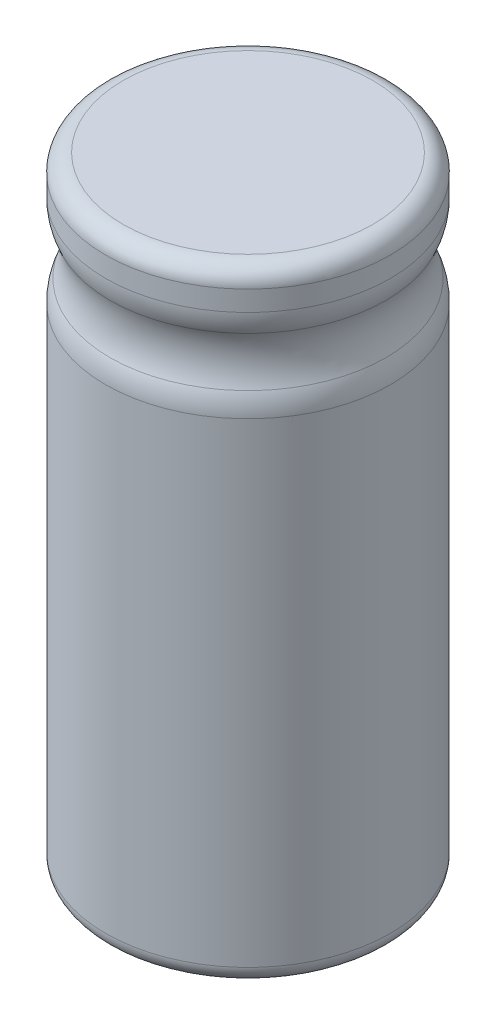
ISO-10303-21;
HEADER;
FILE_DESCRIPTION(('STEP AP214'),'2;1');
FILE_NAME('part.step','',(''),(''),'','','');
FILE_SCHEMA(('AUTOMOTIVE_DESIGN { 1 0 10303 214 1 1 1 1 }'));
ENDSEC;
DATA;
#1=APPLICATION_CONTEXT('core data for automotive mechanical design processes');
#2=APPLICATION_PROTOCOL_DEFINITION('international standard','automotive_design',2000,#1);
#3=PRODUCT_CONTEXT('',#1,'mechanical');
#4=PRODUCT('Part','Part','',(#3));
#5=PRODUCT_RELATED_PRODUCT_CATEGORY('part','',(#4));
#6=PRODUCT_DEFINITION_FORMATION('','',#4);
#7=PRODUCT_DEFINITION_CONTEXT('part definition',#1,'design');
#8=PRODUCT_DEFINITION('design','',#6,#7);
#9=PRODUCT_DEFINITION_SHAPE('','',#8);
#10=(LENGTH_UNIT() NAMED_UNIT(*) SI_UNIT(.MILLI.,.METRE.));
#11=(NAMED_UNIT(*) PLANE_ANGLE_UNIT() SI_UNIT($,.RADIAN.));
#12=(NAMED_UNIT(*) SI_UNIT($,.STERADIAN.) SOLID_ANGLE_UNIT());
#13=UNCERTAINTY_MEASURE_WITH_UNIT(LENGTH_MEASURE(1.E-05),#10,'distance_accuracy_value','');
#14=(GEOMETRIC_REPRESENTATION_CONTEXT(3) GLOBAL_UNCERTAINTY_ASSIGNED_CONTEXT((#13)) GLOBAL_UNIT_ASSIGNED_CONTEXT((#10,
#11,#12)) REPRESENTATION_CONTEXT('',''));
#15=CARTESIAN_POINT('',(0.,0.,0.));
#16=DIRECTION('',(0.,0.,1.));
#17=DIRECTION('',(1.,0.,0.));
#18=AXIS2_PLACEMENT_3D('',#15,#16,#17);
#19=CARTESIAN_POINT('',(0.,35.25,0.));
#20=DIRECTION('',(0.,-1.,0.));
#21=DIRECTION('',(0.,0.,-1.));
#22=AXIS2_PLACEMENT_3D('',#19,#20,#21);
#23=CYLINDRICAL_SURFACE('',#22,16.125);
#24=CARTESIAN_POINT('',(0.,30.9589305519251,0.));
#25=DIRECTION('',(0.,-1.,0.));
#26=DIRECTION('',(0.,0.,-1.));
#27=AXIS2_PLACEMENT_3D('',#24,#25,#26);
#28=CIRCLE('',#27,16.125);
#29=CARTESIAN_POINT('',(0.,30.9589305519251,-16.125));
#30=VERTEX_POINT('',#29);
#31=EDGE_CURVE('E10',#30,#30,#28,.F.);
#32=ORIENTED_EDGE('',*,*,#31,.T.);
#33=EDGE_LOOP('',(#32));
#34=FACE_BOUND('',#33,.T.);
#35=CARTESIAN_POINT('',(0.,33.25,0.));
#36=DIRECTION('',(0.,1.,0.));
#37=DIRECTION('',(0.,0.,1.));
#38=AXIS2_PLACEMENT_3D('',#35,#36,#37);
#39=CIRCLE('',#38,16.125);
#40=CARTESIAN_POINT('',(0.,33.25,16.125));
#41=VERTEX_POINT('',#40);
#42=EDGE_CURVE('E69',#41,#41,#39,.F.);
#43=ORIENTED_EDGE('',*,*,#42,.T.);
#44=EDGE_LOOP('',(#43));
#45=FACE_BOUND('',#44,.T.);
#46=ADVANCED_FACE('F40',(#34,#45),#23,.T.);
#47=CARTESIAN_POINT('',(0.,35.25,0.));
#48=DIRECTION('',(0.,1.,0.));
#49=DIRECTION('',(0.,0.,1.));
#50=AXIS2_PLACEMENT_3D('',#47,#48,#49);
#51=PLANE('',#50);
#52=CARTESIAN_POINT('',(0.,35.25,0.));
#53=DIRECTION('',(0.,1.,0.));
#54=DIRECTION('',(0.,0.,1.));
#55=AXIS2_PLACEMENT_3D('',#52,#53,#54);
#56=CIRCLE('',#55,14.125);
#57=CARTESIAN_POINT('',(0.,35.25,14.125));
#58=VERTEX_POINT('',#57);
#59=EDGE_CURVE('E60',#58,#58,#56,.T.);
#60=ORIENTED_EDGE('',*,*,#59,.T.);
#61=EDGE_LOOP('',(#60));
#62=FACE_BOUND('',#61,.T.);
#63=ADVANCED_FACE('F78',(#62),#51,.T.);
#64=CARTESIAN_POINT('',(0.,33.25,0.));
#65=DIRECTION('',(0.,1.,0.));
#66=DIRECTION('',(0.,0.,1.));
#67=AXIS2_PLACEMENT_3D('',#64,#65,#66);
#68=TOROIDAL_SURFACE('',#67,14.125,2.);
#69=ORIENTED_EDGE('',*,*,#42,.F.);
#70=EDGE_LOOP('',(#69));
#71=FACE_BOUND('',#70,.T.);
#72=ORIENTED_EDGE('',*,*,#59,.F.);
#73=EDGE_LOOP('',(#72));
#74=FACE_BOUND('',#73,.T.);
#75=ADVANCED_FACE('F74',(#71,#74),#68,.T.);
#76=CARTESIAN_POINT('',(0.,25.75,0.));
#77=DIRECTION('',(0.,1.,0.));
#78=DIRECTION('',(0.,0.,1.));
#79=AXIS2_PLACEMENT_3D('',#76,#77,#78);
#80=TOROIDAL_SURFACE('',#79,22.0357952087684,7.);
#81=CARTESIAN_POINT('',(0.,22.9451912412711,0.));
#82=DIRECTION('',(0.,1.,0.));
#83=DIRECTION('',(0.,0.,1.));
#84=AXIS2_PLACEMENT_3D('',#81,#82,#83);
#85=CIRCLE('',#84,15.6222900963547);
#86=CARTESIAN_POINT('',(0.,22.9451912412711,15.6222900963547));
#87=VERTEX_POINT('',#86);
#88=EDGE_CURVE('E51',#87,#87,#85,.T.);
#89=ORIENTED_EDGE('',*,*,#88,.T.);
#90=EDGE_LOOP('',(#89));
#91=FACE_BOUND('',#90,.T.);
#92=CARTESIAN_POINT('',(0.,28.5548087587289,0.));
#93=DIRECTION('',(0.,-1.,0.));
#94=DIRECTION('',(0.,0.,-1.));
#95=AXIS2_PLACEMENT_3D('',#92,#93,#94);
#96=CIRCLE('',#95,15.6222900963547);
#97=CARTESIAN_POINT('',(0.,28.5548087587289,-15.6222900963547));
#98=VERTEX_POINT('',#97);
#99=EDGE_CURVE('E55',#98,#98,#96,.T.);
#100=ORIENTED_EDGE('',*,*,#99,.T.);
#101=EDGE_LOOP('',(#100));
#102=FACE_BOUND('',#101,.T.);
#103=ADVANCED_FACE('F77',(#91,#102),#80,.F.);
#104=CARTESIAN_POINT('',(0.,-35.25,0.));
#105=DIRECTION('',(0.,1.,0.));
#106=DIRECTION('',(0.,0.,1.));
#107=AXIS2_PLACEMENT_3D('',#104,#105,#106);
#108=PLANE('',#107);
#109=CARTESIAN_POINT('',(0.,-35.25,0.));
#110=DIRECTION('',(0.,1.,0.));
#111=DIRECTION('',(0.,0.,1.));
#112=AXIS2_PLACEMENT_3D('',#109,#110,#111);
#113=CIRCLE('',#112,14.125);
#114=CARTESIAN_POINT('',(0.,-35.25,14.125));
#115=VERTEX_POINT('',#114);
#116=EDGE_CURVE('E63',#115,#115,#113,.F.);
#117=ORIENTED_EDGE('',*,*,#116,.T.);
#118=EDGE_LOOP('',(#117));
#119=FACE_BOUND('',#118,.T.);
#120=ADVANCED_FACE('F91',(#119),#108,.F.);
#121=CARTESIAN_POINT('',(0.,-33.25,0.));
#122=DIRECTION('',(0.,1.,0.));
#123=DIRECTION('',(0.,0.,1.));
#124=AXIS2_PLACEMENT_3D('',#121,#122,#123);
#125=TOROIDAL_SURFACE('',#124,14.125,2.);
#126=ORIENTED_EDGE('',*,*,#116,.F.);
#127=EDGE_LOOP('',(#126));
#128=FACE_BOUND('',#127,.T.);
#129=CARTESIAN_POINT('',(0.,-33.25,0.));
#130=DIRECTION('',(0.,1.,0.));
#131=DIRECTION('',(0.,0.,1.));
#132=AXIS2_PLACEMENT_3D('',#129,#130,#131);
#133=CIRCLE('',#132,16.125);
#134=CARTESIAN_POINT('',(0.,-33.25,16.125));
#135=VERTEX_POINT('',#134);
#136=EDGE_CURVE('E66',#135,#135,#133,.T.);
#137=ORIENTED_EDGE('',*,*,#136,.F.);
#138=EDGE_LOOP('',(#137));
#139=FACE_BOUND('',#138,.T.);
#140=ADVANCED_FACE('F93',(#128,#139),#125,.T.);
#141=CARTESIAN_POINT('',(0.,20.5410694480749,0.));
#142=DIRECTION('',(0.,-1.,0.));
#143=DIRECTION('',(0.,0.,-1.));
#144=AXIS2_PLACEMENT_3D('',#141,#142,#143);
#145=CIRCLE('',#144,16.125);
#146=CARTESIAN_POINT('',(0.,20.5410694480749,-16.125));
#147=VERTEX_POINT('',#146);
#148=EDGE_CURVE('E47',#147,#147,#145,.T.);
#149=ORIENTED_EDGE('',*,*,#148,.T.);
#150=EDGE_LOOP('',(#149));
#151=FACE_BOUND('',#150,.T.);
#152=ORIENTED_EDGE('',*,*,#136,.T.);
#153=EDGE_LOOP('',(#152));
#154=FACE_BOUND('',#153,.T.);
#155=ADVANCED_FACE('F88',(#151,#154),#23,.T.);
#156=CARTESIAN_POINT('',(0.,20.5410694480749,0.));
#157=DIRECTION('',(0.,-1.,0.));
#158=DIRECTION('',(0.,0.,-1.));
#159=AXIS2_PLACEMENT_3D('',#156,#157,#158);
#160=TOROIDAL_SURFACE('',#159,10.125,6.);
#161=ORIENTED_EDGE('',*,*,#148,.F.);
#162=EDGE_LOOP('',(#161));
#163=FACE_BOUND('',#162,.T.);
#164=ORIENTED_EDGE('',*,*,#88,.F.);
#165=EDGE_LOOP('',(#164));
#166=FACE_BOUND('',#165,.T.);
#167=ADVANCED_FACE('F97',(#163,#166),#160,.T.);
#168=CARTESIAN_POINT('',(0.,30.9589305519251,0.));
#169=DIRECTION('',(0.,-1.,0.));
#170=DIRECTION('',(0.,0.,-1.));
#171=AXIS2_PLACEMENT_3D('',#168,#169,#170);
#172=TOROIDAL_SURFACE('',#171,10.125,6.);
#173=ORIENTED_EDGE('',*,*,#99,.F.);
#174=EDGE_LOOP('',(#173));
#175=FACE_BOUND('',#174,.T.);
#176=ORIENTED_EDGE('',*,*,#31,.F.);
#177=EDGE_LOOP('',(#176));
#178=FACE_BOUND('',#177,.T.);
#179=ADVANCED_FACE('F42',(#175,#178),#172,.T.);
#180=CLOSED_SHELL('',(#46,#63,#75,#103,#120,#140,#155,#167,#179));
#181=MANIFOLD_SOLID_BREP('B2',#180);
#182=ADVANCED_BREP_SHAPE_REPRESENTATION('',(#18,#181),#14);
#183=SHAPE_DEFINITION_REPRESENTATION(#9,#182);
ENDSEC;
END-ISO-10303-21;
